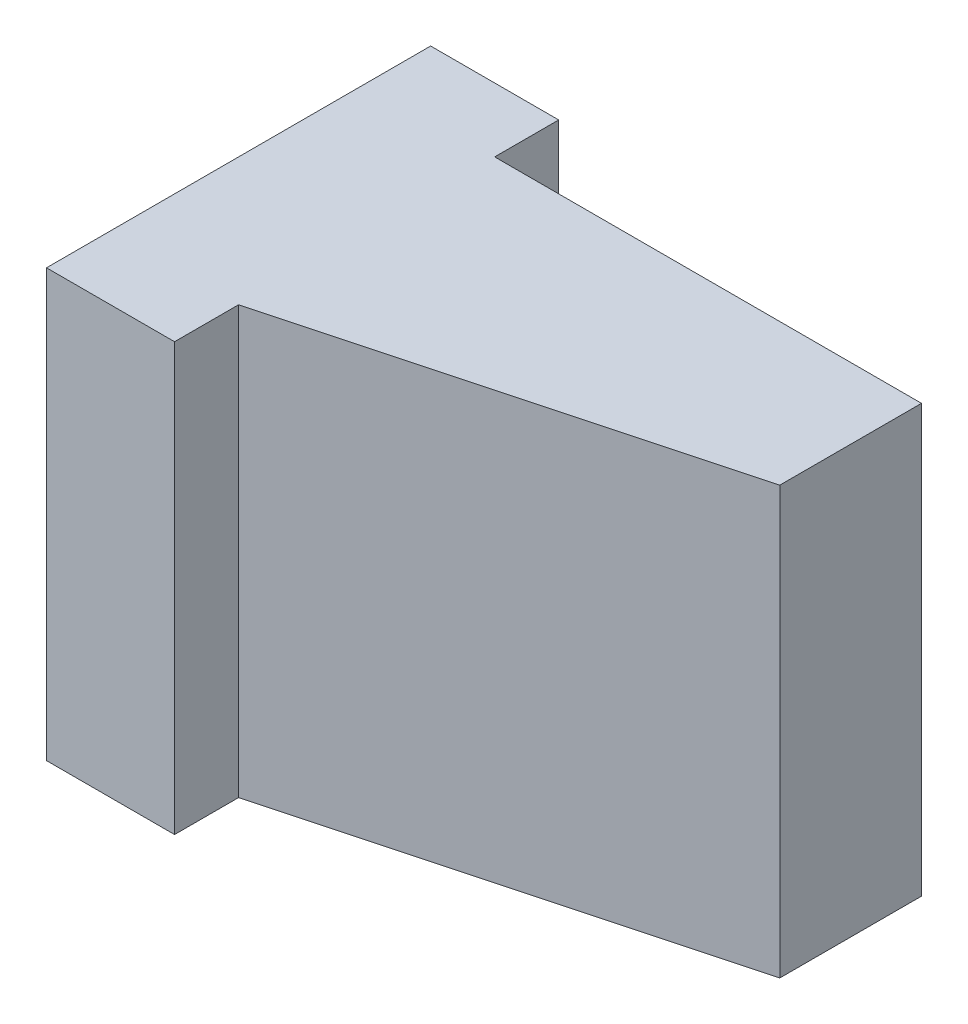
ISO-10303-21;
HEADER;
FILE_DESCRIPTION(('STEP AP214'),'2;1');
FILE_NAME('part.step','',(''),(''),'','','');
FILE_SCHEMA(('AUTOMOTIVE_DESIGN { 1 0 10303 214 1 1 1 1 }'));
ENDSEC;
DATA;
#1=APPLICATION_CONTEXT('core data for automotive mechanical design processes');
#2=APPLICATION_PROTOCOL_DEFINITION('international standard','automotive_design',2000,#1);
#3=PRODUCT_CONTEXT('',#1,'mechanical');
#4=PRODUCT('Part','Part','',(#3));
#5=PRODUCT_RELATED_PRODUCT_CATEGORY('part','',(#4));
#6=PRODUCT_DEFINITION_FORMATION('','',#4);
#7=PRODUCT_DEFINITION_CONTEXT('part definition',#1,'design');
#8=PRODUCT_DEFINITION('design','',#6,#7);
#9=PRODUCT_DEFINITION_SHAPE('','',#8);
#10=(LENGTH_UNIT() NAMED_UNIT(*) SI_UNIT(.MILLI.,.METRE.));
#11=(NAMED_UNIT(*) PLANE_ANGLE_UNIT() SI_UNIT($,.RADIAN.));
#12=(NAMED_UNIT(*) SI_UNIT($,.STERADIAN.) SOLID_ANGLE_UNIT());
#13=UNCERTAINTY_MEASURE_WITH_UNIT(LENGTH_MEASURE(1.E-05),#10,'distance_accuracy_value','');
#14=(GEOMETRIC_REPRESENTATION_CONTEXT(3) GLOBAL_UNCERTAINTY_ASSIGNED_CONTEXT((#13)) GLOBAL_UNIT_ASSIGNED_CONTEXT((#10,
#11,#12)) REPRESENTATION_CONTEXT('',''));
#15=CARTESIAN_POINT('',(0.,0.,0.));
#16=DIRECTION('',(0.,0.,1.));
#17=DIRECTION('',(1.,0.,0.));
#18=AXIS2_PLACEMENT_3D('',#15,#16,#17);
#19=CARTESIAN_POINT('',(-26.8130132931985,10.,6.79736703084927));
#20=DIRECTION('',(-1.,0.,0.));
#21=DIRECTION('',(0.,0.,1.));
#22=AXIS2_PLACEMENT_3D('',#19,#20,#21);
#23=PLANE('',#22);
#24=DIRECTION('',(0.,0.,-1.));
#25=VECTOR('',#24,1.);
#26=CARTESIAN_POINT('',(-26.8130132931985,0.,6.79736703084927));
#27=LINE('',#26,#25);
#28=CARTESIAN_POINT('',(-26.8130132931985,0.,6.79736703084927));
#29=VERTEX_POINT('',#28);
#30=CARTESIAN_POINT('',(-26.8130132931985,0.,5.29736703084927));
#31=VERTEX_POINT('',#30);
#32=EDGE_CURVE('E137',#29,#31,#27,.T.);
#33=ORIENTED_EDGE('',*,*,#32,.T.);
#34=DIRECTION('',(0.,-1.,0.));
#35=VECTOR('',#34,1.);
#36=CARTESIAN_POINT('',(-26.8130132931985,10.,5.29736703084927));
#37=LINE('',#36,#35);
#38=CARTESIAN_POINT('',(-26.8130132931985,10.,5.29736703084927));
#39=VERTEX_POINT('',#38);
#40=EDGE_CURVE('E42',#39,#31,#37,.T.);
#41=ORIENTED_EDGE('',*,*,#40,.F.);
#42=DIRECTION('',(0.,0.,-1.));
#43=VECTOR('',#42,1.);
#44=CARTESIAN_POINT('',(-26.8130132931985,10.,6.79736703084927));
#45=LINE('',#44,#43);
#46=CARTESIAN_POINT('',(-26.8130132931985,10.,6.79736703084927));
#47=VERTEX_POINT('',#46);
#48=EDGE_CURVE('E152',#47,#39,#45,.T.);
#49=ORIENTED_EDGE('',*,*,#48,.F.);
#50=DIRECTION('',(0.,-1.,0.));
#51=VECTOR('',#50,1.);
#52=CARTESIAN_POINT('',(-26.8130132931985,10.,6.79736703084927));
#53=LINE('',#52,#51);
#54=EDGE_CURVE('E133',#47,#29,#53,.T.);
#55=ORIENTED_EDGE('',*,*,#54,.T.);
#56=EDGE_LOOP('',(#33,#41,#49,#55));
#57=FACE_BOUND('',#56,.T.);
#58=ADVANCED_FACE('F39',(#57),#23,.F.);
#59=CARTESIAN_POINT('',(-16.8130132931985,10.,2.61787510653811));
#60=DIRECTION('',(-0.258819045102515,0.,-0.96592582628907));
#61=DIRECTION('',(-0.96592582628907,0.,0.258819045102515));
#62=AXIS2_PLACEMENT_3D('',#59,#60,#61);
#63=PLANE('',#62);
#64=DIRECTION('',(0.96592582628907,0.,-0.258819045102515));
#65=VECTOR('',#64,1.);
#66=CARTESIAN_POINT('',(-16.8130132931985,0.,2.61787510653811));
#67=LINE('',#66,#65);
#68=CARTESIAN_POINT('',(-16.8130132931985,0.,2.61787510653811));
#69=VERTEX_POINT('',#68);
#70=EDGE_CURVE('E140',#31,#69,#67,.T.);
#71=ORIENTED_EDGE('',*,*,#70,.T.);
#72=DIRECTION('',(0.,-1.,0.));
#73=VECTOR('',#72,1.);
#74=CARTESIAN_POINT('',(-16.8130132931985,10.,2.61787510653811));
#75=LINE('',#74,#73);
#76=CARTESIAN_POINT('',(-16.8130132931985,10.,2.61787510653811));
#77=VERTEX_POINT('',#76);
#78=EDGE_CURVE('E161',#77,#69,#75,.T.);
#79=ORIENTED_EDGE('',*,*,#78,.F.);
#80=DIRECTION('',(0.96592582628907,0.,-0.258819045102515));
#81=VECTOR('',#80,1.);
#82=CARTESIAN_POINT('',(-16.8130132931985,10.,2.61787510653811));
#83=LINE('',#82,#81);
#84=EDGE_CURVE('E100',#39,#77,#83,.T.);
#85=ORIENTED_EDGE('',*,*,#84,.F.);
#86=ORIENTED_EDGE('',*,*,#40,.T.);
#87=EDGE_LOOP('',(#71,#79,#85,#86));
#88=FACE_BOUND('',#87,.T.);
#89=ADVANCED_FACE('F167',(#88),#63,.F.);
#90=CARTESIAN_POINT('',(-16.8130132931985,10.,-0.702632969150734));
#91=DIRECTION('',(-1.,0.,0.));
#92=DIRECTION('',(0.,0.,1.));
#93=AXIS2_PLACEMENT_3D('',#90,#91,#92);
#94=PLANE('',#93);
#95=DIRECTION('',(0.,0.,-1.));
#96=VECTOR('',#95,1.);
#97=CARTESIAN_POINT('',(-16.8130132931985,0.,-0.702632969150734));
#98=LINE('',#97,#96);
#99=CARTESIAN_POINT('',(-16.8130132931985,0.,-0.702632969150734));
#100=VERTEX_POINT('',#99);
#101=EDGE_CURVE('E143',#69,#100,#98,.T.);
#102=ORIENTED_EDGE('',*,*,#101,.T.);
#103=DIRECTION('',(0.,-1.,0.));
#104=VECTOR('',#103,1.);
#105=CARTESIAN_POINT('',(-16.8130132931985,10.,-0.702632969150734));
#106=LINE('',#105,#104);
#107=CARTESIAN_POINT('',(-16.8130132931985,10.,-0.702632969150734));
#108=VERTEX_POINT('',#107);
#109=EDGE_CURVE('E159',#108,#100,#106,.T.);
#110=ORIENTED_EDGE('',*,*,#109,.F.);
#111=DIRECTION('',(0.,0.,-1.));
#112=VECTOR('',#111,1.);
#113=CARTESIAN_POINT('',(-16.8130132931985,10.,-0.702632969150734));
#114=LINE('',#113,#112);
#115=EDGE_CURVE('E182',#77,#108,#114,.T.);
#116=ORIENTED_EDGE('',*,*,#115,.F.);
#117=ORIENTED_EDGE('',*,*,#78,.T.);
#118=EDGE_LOOP('',(#102,#110,#116,#117));
#119=FACE_BOUND('',#118,.T.);
#120=ADVANCED_FACE('F176',(#119),#94,.F.);
#121=CARTESIAN_POINT('',(-26.8130132931985,10.,-0.702632969150734));
#122=DIRECTION('',(0.,0.,1.));
#123=DIRECTION('',(1.,0.,0.));
#124=AXIS2_PLACEMENT_3D('',#121,#122,#123);
#125=PLANE('',#124);
#126=DIRECTION('',(-1.,0.,0.));
#127=VECTOR('',#126,1.);
#128=CARTESIAN_POINT('',(-26.8130132931985,0.,-0.702632969150734));
#129=LINE('',#128,#127);
#130=CARTESIAN_POINT('',(-26.8130132931985,0.,-0.702632969150734));
#131=VERTEX_POINT('',#130);
#132=EDGE_CURVE('E145',#100,#131,#129,.T.);
#133=ORIENTED_EDGE('',*,*,#132,.T.);
#134=DIRECTION('',(0.,-1.,0.));
#135=VECTOR('',#134,1.);
#136=CARTESIAN_POINT('',(-26.8130132931985,10.,-0.702632969150734));
#137=LINE('',#136,#135);
#138=CARTESIAN_POINT('',(-26.8130132931985,10.,-0.702632969150734));
#139=VERTEX_POINT('',#138);
#140=EDGE_CURVE('E156',#139,#131,#137,.T.);
#141=ORIENTED_EDGE('',*,*,#140,.F.);
#142=DIRECTION('',(-1.,0.,0.));
#143=VECTOR('',#142,1.);
#144=CARTESIAN_POINT('',(-26.8130132931985,10.,-0.702632969150734));
#145=LINE('',#144,#143);
#146=EDGE_CURVE('E181',#108,#139,#145,.T.);
#147=ORIENTED_EDGE('',*,*,#146,.F.);
#148=ORIENTED_EDGE('',*,*,#109,.T.);
#149=EDGE_LOOP('',(#133,#141,#147,#148));
#150=FACE_BOUND('',#149,.T.);
#151=ADVANCED_FACE('F179',(#150),#125,.F.);
#152=CARTESIAN_POINT('',(-26.8130132931985,10.,-0.702632969150734));
#153=DIRECTION('',(-1.,0.,0.));
#154=DIRECTION('',(0.,0.,1.));
#155=AXIS2_PLACEMENT_3D('',#152,#153,#154);
#156=PLANE('',#155);
#157=DIRECTION('',(0.,0.,-1.));
#158=VECTOR('',#157,1.);
#159=CARTESIAN_POINT('',(-26.8130132931985,0.,-0.702632969150734));
#160=LINE('',#159,#158);
#161=CARTESIAN_POINT('',(-26.8130132931985,0.,-2.20263296915073));
#162=VERTEX_POINT('',#161);
#163=EDGE_CURVE('E147',#131,#162,#160,.T.);
#164=ORIENTED_EDGE('',*,*,#163,.T.);
#165=DIRECTION('',(0.,-1.,0.));
#166=VECTOR('',#165,1.);
#167=CARTESIAN_POINT('',(-26.8130132931985,10.,-2.20263296915073));
#168=LINE('',#167,#166);
#169=CARTESIAN_POINT('',(-26.8130132931985,10.,-2.20263296915073));
#170=VERTEX_POINT('',#169);
#171=EDGE_CURVE('E128',#170,#162,#168,.T.);
#172=ORIENTED_EDGE('',*,*,#171,.F.);
#173=DIRECTION('',(0.,0.,-1.));
#174=VECTOR('',#173,1.);
#175=CARTESIAN_POINT('',(-26.8130132931985,10.,-0.702632969150734));
#176=LINE('',#175,#174);
#177=EDGE_CURVE('E119',#139,#170,#176,.T.);
#178=ORIENTED_EDGE('',*,*,#177,.F.);
#179=ORIENTED_EDGE('',*,*,#140,.T.);
#180=EDGE_LOOP('',(#164,#172,#178,#179));
#181=FACE_BOUND('',#180,.T.);
#182=ADVANCED_FACE('F207',(#181),#156,.F.);
#183=CARTESIAN_POINT('',(-26.8130132931985,10.,-2.20263296915073));
#184=DIRECTION('',(0.,0.,1.));
#185=DIRECTION('',(1.,0.,0.));
#186=AXIS2_PLACEMENT_3D('',#183,#184,#185);
#187=PLANE('',#186);
#188=DIRECTION('',(-1.,0.,0.));
#189=VECTOR('',#188,1.);
#190=CARTESIAN_POINT('',(-26.8130132931985,0.,-2.20263296915073));
#191=LINE('',#190,#189);
#192=CARTESIAN_POINT('',(-29.8130132931985,0.,-2.20263296915073));
#193=VERTEX_POINT('',#192);
#194=EDGE_CURVE('E127',#162,#193,#191,.T.);
#195=ORIENTED_EDGE('',*,*,#194,.T.);
#196=DIRECTION('',(0.,-1.,0.));
#197=VECTOR('',#196,1.);
#198=CARTESIAN_POINT('',(-29.8130132931985,10.,-2.20263296915073));
#199=LINE('',#198,#197);
#200=CARTESIAN_POINT('',(-29.8130132931985,10.,-2.20263296915073));
#201=VERTEX_POINT('',#200);
#202=EDGE_CURVE('E124',#201,#193,#199,.T.);
#203=ORIENTED_EDGE('',*,*,#202,.F.);
#204=DIRECTION('',(-1.,0.,0.));
#205=VECTOR('',#204,1.);
#206=CARTESIAN_POINT('',(-26.8130132931985,10.,-2.20263296915073));
#207=LINE('',#206,#205);
#208=EDGE_CURVE('E113',#170,#201,#207,.T.);
#209=ORIENTED_EDGE('',*,*,#208,.F.);
#210=ORIENTED_EDGE('',*,*,#171,.T.);
#211=EDGE_LOOP('',(#195,#203,#209,#210));
#212=FACE_BOUND('',#211,.T.);
#213=ADVANCED_FACE('F125',(#212),#187,.F.);
#214=CARTESIAN_POINT('',(-29.8130132931985,10.,-2.20263296915073));
#215=DIRECTION('',(1.,0.,0.));
#216=DIRECTION('',(0.,0.,-1.));
#217=AXIS2_PLACEMENT_3D('',#214,#215,#216);
#218=PLANE('',#217);
#219=CARTESIAN_POINT('',(-29.8130132931985,5.,2.29736703084927));
#220=DIRECTION('',(-1.,0.,0.));
#221=DIRECTION('',(0.,0.,1.));
#222=AXIS2_PLACEMENT_3D('',#219,#220,#221);
#223=CIRCLE('',#222,1.25);
#224=CARTESIAN_POINT('',(-29.8130132931985,5.,3.54736703084927));
#225=VERTEX_POINT('',#224);
#226=EDGE_CURVE('E11',#225,#225,#223,.T.);
#227=ORIENTED_EDGE('',*,*,#226,.F.);
#228=EDGE_LOOP('',(#227));
#229=FACE_BOUND('',#228,.T.);
#230=DIRECTION('',(0.,0.,1.));
#231=VECTOR('',#230,1.);
#232=CARTESIAN_POINT('',(-29.8130132931985,0.,-2.20263296915073));
#233=LINE('',#232,#231);
#234=CARTESIAN_POINT('',(-29.8130132931985,0.,6.79736703084927));
#235=VERTEX_POINT('',#234);
#236=EDGE_CURVE('E85',#193,#235,#233,.T.);
#237=ORIENTED_EDGE('',*,*,#236,.T.);
#238=DIRECTION('',(0.,-1.,0.));
#239=VECTOR('',#238,1.);
#240=CARTESIAN_POINT('',(-29.8130132931985,10.,6.79736703084927));
#241=LINE('',#240,#239);
#242=CARTESIAN_POINT('',(-29.8130132931985,10.,6.79736703084927));
#243=VERTEX_POINT('',#242);
#244=EDGE_CURVE('E129',#243,#235,#241,.T.);
#245=ORIENTED_EDGE('',*,*,#244,.F.);
#246=DIRECTION('',(0.,0.,1.));
#247=VECTOR('',#246,1.);
#248=CARTESIAN_POINT('',(-29.8130132931985,10.,-2.20263296915073));
#249=LINE('',#248,#247);
#250=EDGE_CURVE('E117',#201,#243,#249,.T.);
#251=ORIENTED_EDGE('',*,*,#250,.F.);
#252=ORIENTED_EDGE('',*,*,#202,.T.);
#253=EDGE_LOOP('',(#237,#245,#251,#252));
#254=FACE_BOUND('',#253,.T.);
#255=ADVANCED_FACE('F131',(#229,#254),#218,.F.);
#256=CARTESIAN_POINT('',(-29.8130132931985,10.,6.79736703084927));
#257=DIRECTION('',(0.,0.,-1.));
#258=DIRECTION('',(-1.,0.,0.));
#259=AXIS2_PLACEMENT_3D('',#256,#257,#258);
#260=PLANE('',#259);
#261=DIRECTION('',(1.,0.,0.));
#262=VECTOR('',#261,1.);
#263=CARTESIAN_POINT('',(-29.8130132931985,0.,6.79736703084927));
#264=LINE('',#263,#262);
#265=EDGE_CURVE('E91',#235,#29,#264,.T.);
#266=ORIENTED_EDGE('',*,*,#265,.T.);
#267=ORIENTED_EDGE('',*,*,#54,.F.);
#268=DIRECTION('',(1.,0.,0.));
#269=VECTOR('',#268,1.);
#270=CARTESIAN_POINT('',(-29.8130132931985,10.,6.79736703084927));
#271=LINE('',#270,#269);
#272=EDGE_CURVE('E56',#243,#47,#271,.T.);
#273=ORIENTED_EDGE('',*,*,#272,.F.);
#274=ORIENTED_EDGE('',*,*,#244,.T.);
#275=EDGE_LOOP('',(#266,#267,#273,#274));
#276=FACE_BOUND('',#275,.T.);
#277=ADVANCED_FACE('F200',(#276),#260,.F.);
#278=CARTESIAN_POINT('',(0.,10.,0.));
#279=DIRECTION('',(0.,-1.,0.));
#280=DIRECTION('',(0.,0.,-1.));
#281=AXIS2_PLACEMENT_3D('',#278,#279,#280);
#282=PLANE('',#281);
#283=ORIENTED_EDGE('',*,*,#48,.T.);
#284=ORIENTED_EDGE('',*,*,#84,.T.);
#285=ORIENTED_EDGE('',*,*,#115,.T.);
#286=ORIENTED_EDGE('',*,*,#146,.T.);
#287=ORIENTED_EDGE('',*,*,#177,.T.);
#288=ORIENTED_EDGE('',*,*,#208,.T.);
#289=ORIENTED_EDGE('',*,*,#250,.T.);
#290=ORIENTED_EDGE('',*,*,#272,.T.);
#291=EDGE_LOOP('',(#283,#284,#285,#286,#287,#288,#289,#290));
#292=FACE_BOUND('',#291,.T.);
#293=ADVANCED_FACE('F115',(#292),#282,.F.);
#294=CARTESIAN_POINT('',(0.,0.,0.));
#295=DIRECTION('',(0.,-1.,0.));
#296=DIRECTION('',(0.,0.,-1.));
#297=AXIS2_PLACEMENT_3D('',#294,#295,#296);
#298=PLANE('',#297);
#299=ORIENTED_EDGE('',*,*,#32,.F.);
#300=ORIENTED_EDGE('',*,*,#265,.F.);
#301=ORIENTED_EDGE('',*,*,#236,.F.);
#302=ORIENTED_EDGE('',*,*,#194,.F.);
#303=ORIENTED_EDGE('',*,*,#163,.F.);
#304=ORIENTED_EDGE('',*,*,#132,.F.);
#305=ORIENTED_EDGE('',*,*,#101,.F.);
#306=ORIENTED_EDGE('',*,*,#70,.F.);
#307=EDGE_LOOP('',(#299,#300,#301,#302,#303,#304,#305,#306));
#308=FACE_BOUND('',#307,.T.);
#309=ADVANCED_FACE('F172',(#308),#298,.T.);
#310=CARTESIAN_POINT('',(-31.8130132931985,5.,2.29736703084927));
#311=DIRECTION('',(1.,0.,0.));
#312=DIRECTION('',(0.,0.,-1.));
#313=AXIS2_PLACEMENT_3D('',#310,#311,#312);
#314=CYLINDRICAL_SURFACE('',#313,1.25);
#315=CARTESIAN_POINT('',(-31.8130132931985,5.,2.29736703084927));
#316=DIRECTION('',(-1.,0.,0.));
#317=DIRECTION('',(0.,0.,1.));
#318=AXIS2_PLACEMENT_3D('',#315,#316,#317);
#319=CIRCLE('',#318,1.25);
#320=CARTESIAN_POINT('',(-31.8130132931985,5.,3.54736703084927));
#321=VERTEX_POINT('',#320);
#322=EDGE_CURVE('E141',#321,#321,#319,.T.);
#323=ORIENTED_EDGE('',*,*,#322,.F.);
#324=EDGE_LOOP('',(#323));
#325=FACE_BOUND('',#324,.T.);
#326=ORIENTED_EDGE('',*,*,#226,.T.);
#327=EDGE_LOOP('',(#326));
#328=FACE_BOUND('',#327,.T.);
#329=ADVANCED_FACE('F193',(#325,#328),#314,.T.);
#330=CARTESIAN_POINT('',(-31.8130132931985,5.,2.29736703084927));
#331=DIRECTION('',(-1.,0.,0.));
#332=DIRECTION('',(0.,0.,1.));
#333=AXIS2_PLACEMENT_3D('',#330,#331,#332);
#334=PLANE('',#333);
#335=ORIENTED_EDGE('',*,*,#322,.T.);
#336=EDGE_LOOP('',(#335));
#337=FACE_BOUND('',#336,.T.);
#338=ADVANCED_FACE('F191',(#337),#334,.T.);
#339=CLOSED_SHELL('',(#58,#89,#120,#151,#182,#213,#255,#277,#293,#309,#329,#338));
#340=MANIFOLD_SOLID_BREP('B2',#339);
#341=ADVANCED_BREP_SHAPE_REPRESENTATION('',(#18,#340),#14);
#342=SHAPE_DEFINITION_REPRESENTATION(#9,#341);
ENDSEC;
END-ISO-10303-21;
